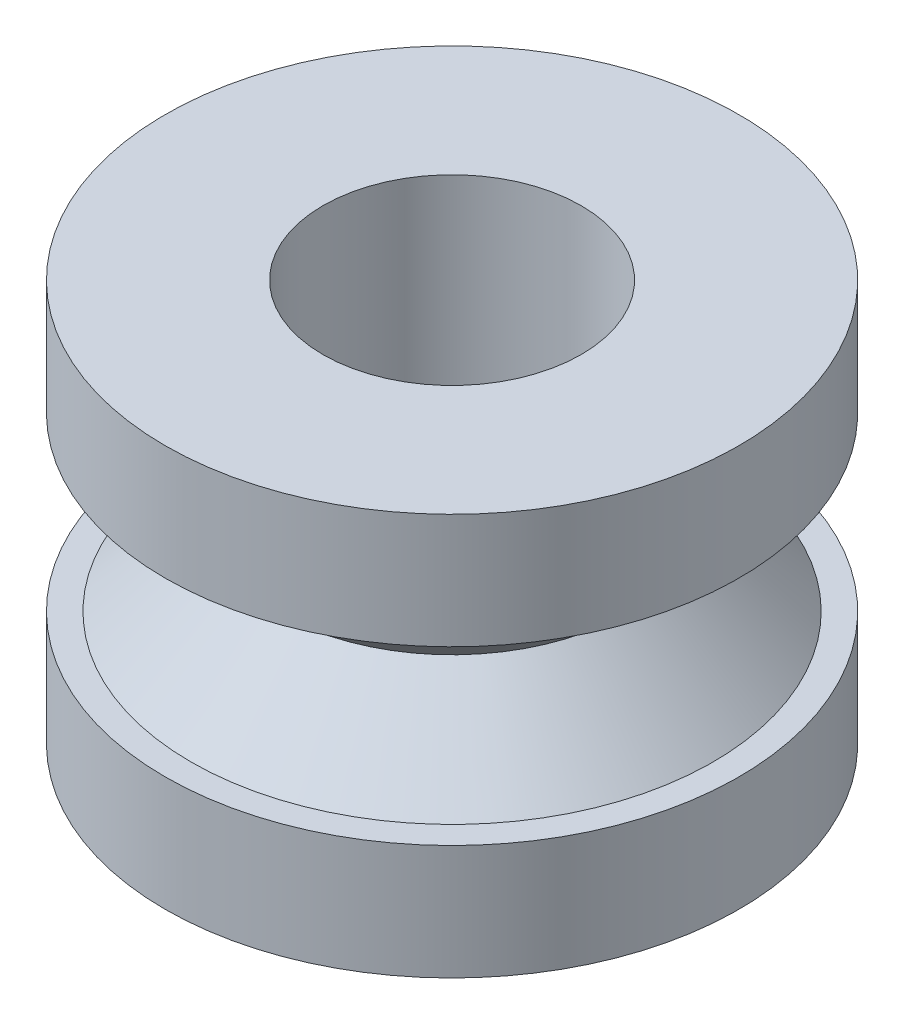
ISO-10303-21;
HEADER;
FILE_DESCRIPTION(('STEP AP214'),'2;1');
FILE_NAME('part.step','',(''),(''),'','','');
FILE_SCHEMA(('AUTOMOTIVE_DESIGN { 1 0 10303 214 1 1 1 1 }'));
ENDSEC;
DATA;
#1=APPLICATION_CONTEXT('core data for automotive mechanical design processes');
#2=APPLICATION_PROTOCOL_DEFINITION('international standard','automotive_design',2000,#1);
#3=PRODUCT_CONTEXT('',#1,'mechanical');
#4=PRODUCT('Part','Part','',(#3));
#5=PRODUCT_RELATED_PRODUCT_CATEGORY('part','',(#4));
#6=PRODUCT_DEFINITION_FORMATION('','',#4);
#7=PRODUCT_DEFINITION_CONTEXT('part definition',#1,'design');
#8=PRODUCT_DEFINITION('design','',#6,#7);
#9=PRODUCT_DEFINITION_SHAPE('','',#8);
#10=(LENGTH_UNIT() NAMED_UNIT(*) SI_UNIT(.MILLI.,.METRE.));
#11=(NAMED_UNIT(*) PLANE_ANGLE_UNIT() SI_UNIT($,.RADIAN.));
#12=(NAMED_UNIT(*) SI_UNIT($,.STERADIAN.) SOLID_ANGLE_UNIT());
#13=UNCERTAINTY_MEASURE_WITH_UNIT(LENGTH_MEASURE(1.E-05),#10,'distance_accuracy_value','');
#14=(GEOMETRIC_REPRESENTATION_CONTEXT(3) GLOBAL_UNCERTAINTY_ASSIGNED_CONTEXT((#13)) GLOBAL_UNIT_ASSIGNED_CONTEXT((#10,
#11,#12)) REPRESENTATION_CONTEXT('',''));
#15=CARTESIAN_POINT('',(0.,0.,0.));
#16=DIRECTION('',(0.,0.,1.));
#17=DIRECTION('',(1.,0.,0.));
#18=AXIS2_PLACEMENT_3D('',#15,#16,#17);
#19=CARTESIAN_POINT('',(0.,7.,0.));
#20=DIRECTION('',(0.,1.,0.));
#21=DIRECTION('',(0.,0.,1.));
#22=AXIS2_PLACEMENT_3D('',#19,#20,#21);
#23=PLANE('',#22);
#24=CARTESIAN_POINT('',(0.,7.,0.));
#25=DIRECTION('',(0.,1.,0.));
#26=DIRECTION('',(0.,0.,1.));
#27=AXIS2_PLACEMENT_3D('',#24,#25,#26);
#28=CIRCLE('',#27,2.25);
#29=CARTESIAN_POINT('',(0.,7.,2.25));
#30=VERTEX_POINT('',#29);
#31=EDGE_CURVE('E63',#30,#30,#28,.T.);
#32=ORIENTED_EDGE('',*,*,#31,.F.);
#33=EDGE_LOOP('',(#32));
#34=FACE_BOUND('',#33,.T.);
#35=CARTESIAN_POINT('',(0.,7.,0.));
#36=DIRECTION('',(0.,1.,0.));
#37=DIRECTION('',(0.,0.,1.));
#38=AXIS2_PLACEMENT_3D('',#35,#36,#37);
#39=CIRCLE('',#38,5.);
#40=CARTESIAN_POINT('',(0.,7.,5.));
#41=VERTEX_POINT('',#40);
#42=EDGE_CURVE('E78',#41,#41,#39,.T.);
#43=ORIENTED_EDGE('',*,*,#42,.T.);
#44=EDGE_LOOP('',(#43));
#45=FACE_BOUND('',#44,.T.);
#46=ADVANCED_FACE('F51',(#34,#45),#23,.T.);
#47=CARTESIAN_POINT('',(0.,0.,0.));
#48=DIRECTION('',(0.,1.,0.));
#49=DIRECTION('',(0.,0.,1.));
#50=AXIS2_PLACEMENT_3D('',#47,#48,#49);
#51=PLANE('',#50);
#52=CARTESIAN_POINT('',(0.,0.,0.));
#53=DIRECTION('',(0.,1.,0.));
#54=DIRECTION('',(0.,0.,1.));
#55=AXIS2_PLACEMENT_3D('',#52,#53,#54);
#56=CIRCLE('',#55,2.25);
#57=CARTESIAN_POINT('',(0.,0.,2.25));
#58=VERTEX_POINT('',#57);
#59=EDGE_CURVE('E66',#58,#58,#56,.T.);
#60=ORIENTED_EDGE('',*,*,#59,.T.);
#61=EDGE_LOOP('',(#60));
#62=FACE_BOUND('',#61,.T.);
#63=CARTESIAN_POINT('',(0.,0.,0.));
#64=DIRECTION('',(0.,1.,0.));
#65=DIRECTION('',(0.,0.,1.));
#66=AXIS2_PLACEMENT_3D('',#63,#64,#65);
#67=CIRCLE('',#66,5.);
#68=CARTESIAN_POINT('',(0.,0.,5.));
#69=VERTEX_POINT('',#68);
#70=EDGE_CURVE('E72',#69,#69,#67,.T.);
#71=ORIENTED_EDGE('',*,*,#70,.F.);
#72=EDGE_LOOP('',(#71));
#73=FACE_BOUND('',#72,.T.);
#74=ADVANCED_FACE('F101',(#62,#73),#51,.F.);
#75=CARTESIAN_POINT('',(0.,7.,0.));
#76=DIRECTION('',(0.,-1.,0.));
#77=DIRECTION('',(0.,0.,-1.));
#78=AXIS2_PLACEMENT_3D('',#75,#76,#77);
#79=CYLINDRICAL_SURFACE('',#78,2.25);
#80=ORIENTED_EDGE('',*,*,#31,.T.);
#81=EDGE_LOOP('',(#80));
#82=FACE_BOUND('',#81,.T.);
#83=ORIENTED_EDGE('',*,*,#59,.F.);
#84=EDGE_LOOP('',(#83));
#85=FACE_BOUND('',#84,.T.);
#86=ADVANCED_FACE('F107',(#82,#85),#79,.F.);
#87=CARTESIAN_POINT('',(0.,2.,0.));
#88=DIRECTION('',(0.,1.,0.));
#89=DIRECTION('',(0.,0.,1.));
#90=AXIS2_PLACEMENT_3D('',#87,#88,#89);
#91=PLANE('',#90);
#92=CARTESIAN_POINT('',(0.,2.,0.));
#93=DIRECTION('',(0.,1.,0.));
#94=DIRECTION('',(0.,0.,1.));
#95=AXIS2_PLACEMENT_3D('',#92,#93,#94);
#96=CIRCLE('',#95,4.54999999999999);
#97=CARTESIAN_POINT('',(0.,2.,4.54999999999999));
#98=VERTEX_POINT('',#97);
#99=EDGE_CURVE('E11',#98,#98,#96,.F.);
#100=ORIENTED_EDGE('',*,*,#99,.T.);
#101=EDGE_LOOP('',(#100));
#102=FACE_BOUND('',#101,.T.);
#103=CARTESIAN_POINT('',(0.,2.,0.));
#104=DIRECTION('',(0.,1.,0.));
#105=DIRECTION('',(0.,0.,1.));
#106=AXIS2_PLACEMENT_3D('',#103,#104,#105);
#107=CIRCLE('',#106,5.);
#108=CARTESIAN_POINT('',(0.,2.,5.));
#109=VERTEX_POINT('',#108);
#110=EDGE_CURVE('E69',#109,#109,#107,.T.);
#111=ORIENTED_EDGE('',*,*,#110,.T.);
#112=EDGE_LOOP('',(#111));
#113=FACE_BOUND('',#112,.T.);
#114=ADVANCED_FACE('F97',(#102,#113),#91,.T.);
#115=CARTESIAN_POINT('',(0.,2.,0.));
#116=DIRECTION('',(0.,-1.,0.));
#117=DIRECTION('',(0.,0.,-1.));
#118=AXIS2_PLACEMENT_3D('',#115,#116,#117);
#119=CYLINDRICAL_SURFACE('',#118,5.);
#120=ORIENTED_EDGE('',*,*,#110,.F.);
#121=EDGE_LOOP('',(#120));
#122=FACE_BOUND('',#121,.T.);
#123=ORIENTED_EDGE('',*,*,#70,.T.);
#124=EDGE_LOOP('',(#123));
#125=FACE_BOUND('',#124,.T.);
#126=ADVANCED_FACE('F89',(#122,#125),#119,.T.);
#127=CARTESIAN_POINT('',(0.,5.,0.));
#128=DIRECTION('',(0.,1.,0.));
#129=DIRECTION('',(0.,0.,1.));
#130=AXIS2_PLACEMENT_3D('',#127,#128,#129);
#131=PLANE('',#130);
#132=CARTESIAN_POINT('',(0.,5.,0.));
#133=DIRECTION('',(0.,1.,0.));
#134=DIRECTION('',(0.,0.,1.));
#135=AXIS2_PLACEMENT_3D('',#132,#133,#134);
#136=CIRCLE('',#135,4.55000000000001);
#137=CARTESIAN_POINT('',(0.,5.,4.55000000000001));
#138=VERTEX_POINT('',#137);
#139=EDGE_CURVE('E59',#138,#138,#136,.T.);
#140=ORIENTED_EDGE('',*,*,#139,.T.);
#141=EDGE_LOOP('',(#140));
#142=FACE_BOUND('',#141,.T.);
#143=CARTESIAN_POINT('',(0.,5.,0.));
#144=DIRECTION('',(0.,1.,0.));
#145=DIRECTION('',(0.,0.,1.));
#146=AXIS2_PLACEMENT_3D('',#143,#144,#145);
#147=CIRCLE('',#146,5.);
#148=CARTESIAN_POINT('',(0.,5.,5.));
#149=VERTEX_POINT('',#148);
#150=EDGE_CURVE('E75',#149,#149,#147,.T.);
#151=ORIENTED_EDGE('',*,*,#150,.F.);
#152=EDGE_LOOP('',(#151));
#153=FACE_BOUND('',#152,.T.);
#154=ADVANCED_FACE('F87',(#142,#153),#131,.F.);
#155=CARTESIAN_POINT('',(0.,5.,0.));
#156=DIRECTION('',(0.,1.,0.));
#157=DIRECTION('',(0.,0.,1.));
#158=AXIS2_PLACEMENT_3D('',#155,#156,#157);
#159=CYLINDRICAL_SURFACE('',#158,5.);
#160=ORIENTED_EDGE('',*,*,#150,.T.);
#161=EDGE_LOOP('',(#160));
#162=FACE_BOUND('',#161,.T.);
#163=ORIENTED_EDGE('',*,*,#42,.F.);
#164=EDGE_LOOP('',(#163));
#165=FACE_BOUND('',#164,.T.);
#166=ADVANCED_FACE('F84',(#162,#165),#159,.T.);
#167=CARTESIAN_POINT('',(0.,3.50000000000001,0.));
#168=DIRECTION('',(0.,-1.,0.));
#169=DIRECTION('',(0.,0.,-1.));
#170=AXIS2_PLACEMENT_3D('',#167,#168,#169);
#171=CONICAL_SURFACE('',#170,3.05,0.785398163397444);
#172=ORIENTED_EDGE('',*,*,#99,.F.);
#173=EDGE_LOOP('',(#172));
#174=FACE_BOUND('',#173,.T.);
#175=CARTESIAN_POINT('',(0.,3.50000000000001,0.));
#176=DIRECTION('',(0.,1.,0.));
#177=DIRECTION('',(0.,0.,1.));
#178=AXIS2_PLACEMENT_3D('',#175,#176,#177);
#179=CIRCLE('',#178,3.05);
#180=CARTESIAN_POINT('',(0.,3.50000000000001,3.05));
#181=VERTEX_POINT('',#180);
#182=EDGE_CURVE('E55',#181,#181,#179,.T.);
#183=ORIENTED_EDGE('',*,*,#182,.F.);
#184=EDGE_LOOP('',(#183));
#185=FACE_BOUND('',#184,.T.);
#186=ADVANCED_FACE('F53',(#174,#185),#171,.T.);
#187=CARTESIAN_POINT('',(0.,5.,0.));
#188=DIRECTION('',(0.,1.,0.));
#189=DIRECTION('',(0.,0.,1.));
#190=AXIS2_PLACEMENT_3D('',#187,#188,#189);
#191=CONICAL_SURFACE('',#190,4.55000000000001,0.785398163397454);
#192=ORIENTED_EDGE('',*,*,#182,.T.);
#193=EDGE_LOOP('',(#192));
#194=FACE_BOUND('',#193,.T.);
#195=ORIENTED_EDGE('',*,*,#139,.F.);
#196=EDGE_LOOP('',(#195));
#197=FACE_BOUND('',#196,.T.);
#198=ADVANCED_FACE('F113',(#194,#197),#191,.T.);
#199=CLOSED_SHELL('',(#46,#74,#86,#114,#126,#154,#166,#186,#198));
#200=MANIFOLD_SOLID_BREP('B2',#199);
#201=ADVANCED_BREP_SHAPE_REPRESENTATION('',(#18,#200),#14);
#202=SHAPE_DEFINITION_REPRESENTATION(#9,#201);
ENDSEC;
END-ISO-10303-21;
